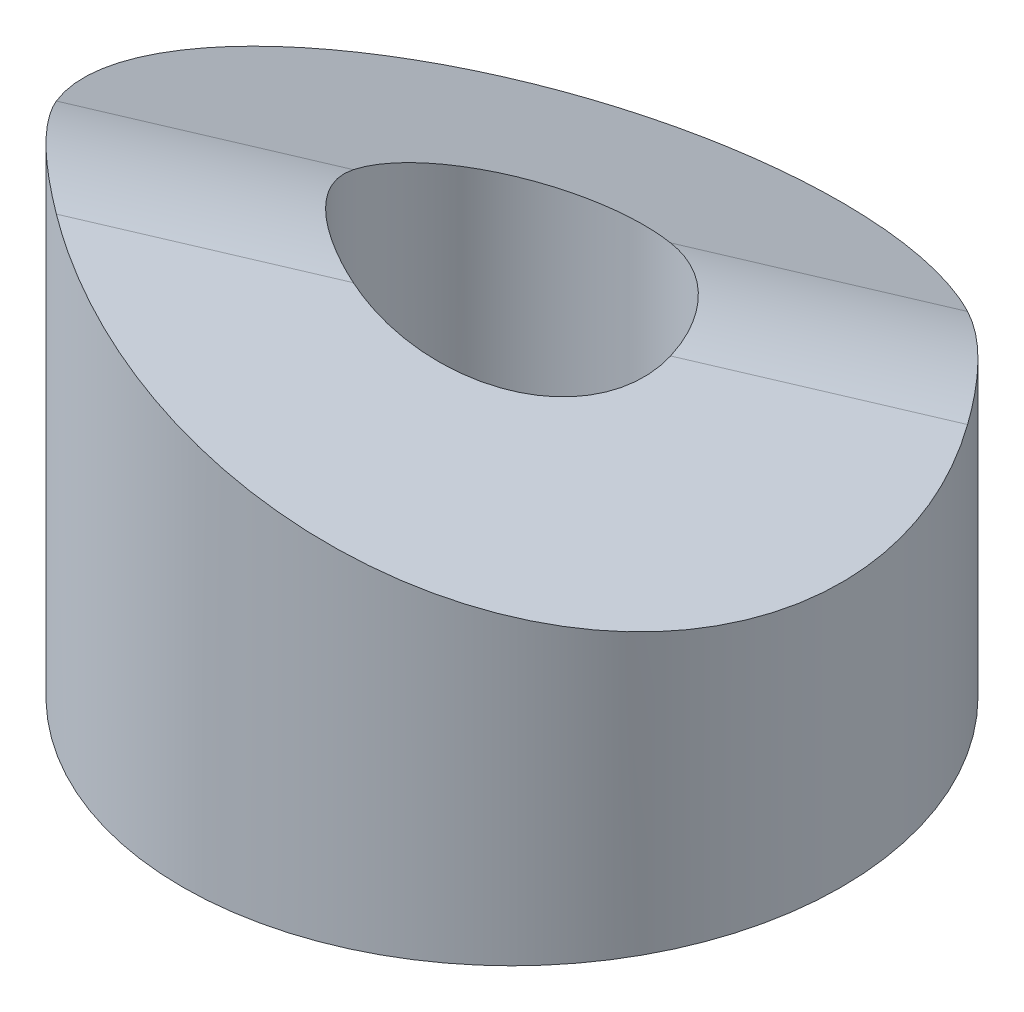
ISO-10303-21;
HEADER;
FILE_DESCRIPTION(('STEP AP214'),'2;1');
FILE_NAME('part.step','',(''),(''),'','','');
FILE_SCHEMA(('AUTOMOTIVE_DESIGN { 1 0 10303 214 1 1 1 1 }'));
ENDSEC;
DATA;
#1=APPLICATION_CONTEXT('core data for automotive mechanical design processes');
#2=APPLICATION_PROTOCOL_DEFINITION('international standard','automotive_design',2000,#1);
#3=PRODUCT_CONTEXT('',#1,'mechanical');
#4=PRODUCT('Part','Part','',(#3));
#5=PRODUCT_RELATED_PRODUCT_CATEGORY('part','',(#4));
#6=PRODUCT_DEFINITION_FORMATION('','',#4);
#7=PRODUCT_DEFINITION_CONTEXT('part definition',#1,'design');
#8=PRODUCT_DEFINITION('design','',#6,#7);
#9=PRODUCT_DEFINITION_SHAPE('','',#8);
#10=(LENGTH_UNIT() NAMED_UNIT(*) SI_UNIT(.MILLI.,.METRE.));
#11=(NAMED_UNIT(*) PLANE_ANGLE_UNIT() SI_UNIT($,.RADIAN.));
#12=(NAMED_UNIT(*) SI_UNIT($,.STERADIAN.) SOLID_ANGLE_UNIT());
#13=UNCERTAINTY_MEASURE_WITH_UNIT(LENGTH_MEASURE(1.E-05),#10,'distance_accuracy_value','');
#14=(GEOMETRIC_REPRESENTATION_CONTEXT(3) GLOBAL_UNCERTAINTY_ASSIGNED_CONTEXT((#13)) GLOBAL_UNIT_ASSIGNED_CONTEXT((#10,
#11,#12)) REPRESENTATION_CONTEXT('',''));
#15=CARTESIAN_POINT('',(0.,0.,0.));
#16=DIRECTION('',(0.,0.,1.));
#17=DIRECTION('',(1.,0.,0.));
#18=AXIS2_PLACEMENT_3D('',#15,#16,#17);
#19=CARTESIAN_POINT('',(0.,12.7,0.));
#20=DIRECTION('',(0.,-1.,0.));
#21=DIRECTION('',(0.,0.,-1.));
#22=AXIS2_PLACEMENT_3D('',#19,#20,#21);
#23=CYLINDRICAL_SURFACE('',#22,7.9375);
#24=CARTESIAN_POINT('',(0.,0.,0.));
#25=DIRECTION('',(0.,1.,0.));
#26=DIRECTION('',(0.,0.,1.));
#27=AXIS2_PLACEMENT_3D('',#24,#25,#26);
#28=CIRCLE('',#27,7.9375);
#29=CARTESIAN_POINT('',(0.,0.,7.9375));
#30=VERTEX_POINT('',#29);
#31=EDGE_CURVE('E110',#30,#30,#28,.T.);
#32=ORIENTED_EDGE('',*,*,#31,.T.);
#33=EDGE_LOOP('',(#32));
#34=FACE_BOUND('',#33,.T.);
#35=CARTESIAN_POINT('',(0.,9.525,0.));
#36=DIRECTION('',(0.,-0.928476690885259,0.371390676354104));
#37=DIRECTION('',(0.,-0.371390676354104,-0.92847669088526));
#38=AXIS2_PLACEMENT_3D('',#35,#36,#37);
#39=ELLIPSE('',#38,8.54894913132602,7.9375);
#40=CARTESIAN_POINT('',(-6.66656205617944,11.2482925045324,4.30823126133088));
#41=VERTEX_POINT('',#40);
#42=CARTESIAN_POINT('',(4.30823126133088,6.85837517752823,-6.66656205617944));
#43=VERTEX_POINT('',#42);
#44=EDGE_CURVE('E89',#41,#43,#39,.T.);
#45=ORIENTED_EDGE('',*,*,#44,.T.);
#46=CARTESIAN_POINT('',(4.30823126133088,6.85837517752823,-6.66656205617944));
#47=CARTESIAN_POINT('',(4.44018053283376,6.89249503951867,-6.58132556952442));
#48=CARTESIAN_POINT('',(4.57043572017866,6.92193001275825,-6.49156235753595));
#49=CARTESIAN_POINT('',(4.82654034498174,6.97121347274696,-6.30345486665733));
#50=CARTESIAN_POINT('',(4.95238856077898,6.99105932049479,-6.20510823432544));
#51=CARTESIAN_POINT('',(5.19552041054119,7.02055664741903,-6.002904849344));
#52=CARTESIAN_POINT('',(5.31293931876672,7.03044983553693,-5.89924647110299));
#53=CARTESIAN_POINT('',(5.54159838903361,7.04080566970517,-5.68499438169255));
#54=CARTESIAN_POINT('',(5.65284038918268,7.0412711363928,-5.5744027547836));
#55=CARTESIAN_POINT('',(5.92868456462497,7.03036596915545,-5.28338028838821));
#56=CARTESIAN_POINT('',(6.08839084588869,7.01223991073966,-5.09843925089711));
#57=CARTESIAN_POINT('',(6.31489127127382,6.96790187456653,-4.81055576389274));
#58=CARTESIAN_POINT('',(6.38888093281967,6.94999835184293,-4.71181642470069));
#59=CARTESIAN_POINT('',(6.53165813283735,6.90845798798185,-4.51181058708581));
#60=CARTESIAN_POINT('',(6.60044558395637,6.8848210505999,-4.41054404626549));
#61=CARTESIAN_POINT('',(6.66656205617943,6.85837517752823,-4.30823126133088));
#62=B_SPLINE_CURVE_WITH_KNOTS('',3,(#46,#47,#48,#49,#50,#51,#52,#53,#54,#55,#56,#57,#58,#59,#60,
#61),.UNSPECIFIED.,.F.,.F.,(4,2,2,2,2,2,2,4),(0.,0.48212803022374,0.964388670332843,
1.43463191620439,1.90473447004844,2.63738065918797,3.01119213682577,3.38500988991819),.UNSPECIFIED.);
#63=CARTESIAN_POINT('',(6.66656205617944,6.85837517752823,-4.30823126133088));
#64=VERTEX_POINT('',#63);
#65=EDGE_CURVE('E95',#43,#64,#62,.T.);
#66=ORIENTED_EDGE('',*,*,#65,.T.);
#67=CARTESIAN_POINT('',(0.,9.525,0.));
#68=DIRECTION('',(-0.371390676354104,-0.928476690885259,0.));
#69=DIRECTION('',(0.92847669088526,-0.371390676354104,0.));
#70=AXIS2_PLACEMENT_3D('',#67,#68,#69);
#71=ELLIPSE('',#70,8.54894913132602,7.9375);
#72=CARTESIAN_POINT('',(-4.30823126133088,11.2482925045323,6.66656205617944));
#73=VERTEX_POINT('',#72);
#74=EDGE_CURVE('E90',#64,#73,#71,.T.);
#75=ORIENTED_EDGE('',*,*,#74,.T.);
#76=CARTESIAN_POINT('',(-4.30823126133088,11.2482925045323,6.66656205617944));
#77=CARTESIAN_POINT('',(-4.40750733230858,11.2880217792611,6.60242527729172));
#78=CARTESIAN_POINT('',(-4.50644474603532,11.3239294478226,6.53532505164408));
#79=CARTESIAN_POINT('',(-4.70294443046754,11.3875932973205,6.39536618779092));
#80=CARTESIAN_POINT('',(-4.80050586510717,11.4153447097237,6.32250421245663));
#81=CARTESIAN_POINT('',(-4.99334935944246,11.4621186403639,6.17133526254932));
#82=CARTESIAN_POINT('',(-5.08863343440826,11.4811491690885,6.09303336122781));
#83=CARTESIAN_POINT('',(-5.2761950538548,11.5101399590878,5.93135666127639));
#84=CARTESIAN_POINT('',(-5.36847336876836,11.5201025625655,5.84798317855148));
#85=CARTESIAN_POINT('',(-5.5496106899698,11.530774621615,5.67638516397554));
#86=CARTESIAN_POINT('',(-5.63845600732794,11.5314502181526,5.58814405823189));
#87=CARTESIAN_POINT('',(-5.81166903060222,11.5234463225004,5.40777616773249));
#88=CARTESIAN_POINT('',(-5.89603666499984,11.5147666809339,5.31564932095499));
#89=CARTESIAN_POINT('',(-6.05958581820048,11.4882581435298,5.12842632331201));
#90=CARTESIAN_POINT('',(-6.13877497864839,11.4704430883957,5.03333486811469));
#91=CARTESIAN_POINT('',(-6.29165349004505,11.42603692491,4.84087766199855));
#92=CARTESIAN_POINT('',(-6.3653452876548,11.3994497496032,4.74351294845833));
#93=CARTESIAN_POINT('',(-6.47646096775292,11.3512471395866,4.58956509662136));
#94=CARTESIAN_POINT('',(-6.51583066433088,11.3324255027004,4.53348627564056));
#95=CARTESIAN_POINT('',(-6.5926326299594,11.2922409959197,4.42105531497422));
#96=CARTESIAN_POINT('',(-6.63006788168686,11.2708822166053,4.36470375206143));
#97=CARTESIAN_POINT('',(-6.66656205617944,11.2482925045324,4.30823126133088));
#98=B_SPLINE_CURVE_WITH_KNOTS('',3,(#76,#77,#78,#79,#80,#81,#82,#83,#84,#85,#86,#87,#88,#89,#90,
#91,#92,#93,#94,#95,#96,#97),.UNSPECIFIED.,.F.,.F.,(4,2,2,2,2,2,2,2,2,2,4),(0.,
0.374033310793306,0.748284866124966,1.12219196366536,1.4960024553053,1.87117544396496,
2.24635442316631,2.62096665561494,2.99541115563377,3.20851686847709,3.42128354360048),.UNSPECIFIED.);
#99=EDGE_CURVE('E87',#73,#41,#98,.T.);
#100=ORIENTED_EDGE('',*,*,#99,.T.);
#101=EDGE_LOOP('',(#45,#66,#75,#100));
#102=FACE_BOUND('',#101,.T.);
#103=ADVANCED_FACE('F39',(#34,#102),#23,.T.);
#104=CARTESIAN_POINT('',(0.,0.,0.));
#105=DIRECTION('',(0.,1.,0.));
#106=DIRECTION('',(0.,0.,1.));
#107=AXIS2_PLACEMENT_3D('',#104,#105,#106);
#108=PLANE('',#107);
#109=ORIENTED_EDGE('',*,*,#31,.F.);
#110=EDGE_LOOP('',(#109));
#111=FACE_BOUND('',#110,.T.);
#112=CARTESIAN_POINT('',(0.,0.,0.));
#113=DIRECTION('',(0.,1.,0.));
#114=DIRECTION('',(0.,0.,1.));
#115=AXIS2_PLACEMENT_3D('',#112,#113,#114);
#116=CIRCLE('',#115,3.175);
#117=CARTESIAN_POINT('',(0.,0.,3.175));
#118=VERTEX_POINT('',#117);
#119=EDGE_CURVE('E106',#118,#118,#116,.T.);
#120=ORIENTED_EDGE('',*,*,#119,.T.);
#121=EDGE_LOOP('',(#120));
#122=FACE_BOUND('',#121,.T.);
#123=ADVANCED_FACE('F132',(#111,#122),#108,.F.);
#124=CARTESIAN_POINT('',(0.,12.7,0.));
#125=DIRECTION('',(0.,-1.,0.));
#126=DIRECTION('',(0.,0.,-1.));
#127=AXIS2_PLACEMENT_3D('',#124,#125,#126);
#128=CYLINDRICAL_SURFACE('',#127,3.175);
#129=CARTESIAN_POINT('',(0.,9.525,0.));
#130=DIRECTION('',(-0.371390676354104,-0.928476690885259,0.));
#131=DIRECTION('',(0.92847669088526,-0.371390676354104,0.));
#132=AXIS2_PLACEMENT_3D('',#129,#130,#131);
#133=ELLIPSE('',#132,3.41957965253041,3.175);
#134=CARTESIAN_POINT('',(3.08963169273473,8.28914732290611,-0.731300897886174));
#135=VERTEX_POINT('',#134);
#136=CARTESIAN_POINT('',(-0.731300897886171,9.81752035915447,3.08963169273473));
#137=VERTEX_POINT('',#136);
#138=EDGE_CURVE('E149',#135,#137,#133,.T.);
#139=ORIENTED_EDGE('',*,*,#138,.F.);
#140=CARTESIAN_POINT('',(3.08963169273473,8.28914732290611,-0.731300897886173));
#141=CARTESIAN_POINT('',(3.06936290011752,8.29726711196511,-0.816961562861372));
#142=CARTESIAN_POINT('',(3.04551644804464,8.30526041723585,-0.901786963212657));
#143=CARTESIAN_POINT('',(2.99084166337354,8.32063053274964,-1.06922312023403));
#144=CARTESIAN_POINT('',(2.96001265226662,8.32800728298541,-1.15183366080888));
#145=CARTESIAN_POINT('',(2.8915560140739,8.34177787048075,-1.31426531204879));
#146=CARTESIAN_POINT('',(2.85392954317246,8.34817187455447,-1.39408689433834));
#147=CARTESIAN_POINT('',(2.7721407924476,8.35969257996766,-1.55037104853168));
#148=CARTESIAN_POINT('',(2.72797888907768,8.36481935425661,-1.62683381358105));
#149=CARTESIAN_POINT('',(2.58597168220242,8.37794352429865,-1.85054587687588));
#150=CARTESIAN_POINT('',(2.47862633493533,8.3836801965786,-1.99206808493242));
#151=CARTESIAN_POINT('',(2.24187616828036,8.38809051877317,-2.25520823053523));
#152=CARTESIAN_POINT('',(2.11247791491635,8.3867662674604,-2.37683207154888));
#153=CARTESIAN_POINT('',(1.83758445170494,8.3773789420086,-2.5950402635009));
#154=CARTESIAN_POINT('',(1.69237045614953,8.36942084797047,-2.69198416569193));
#155=CARTESIAN_POINT('',(1.38839585547521,8.34822328070023,-2.86061693874038));
#156=CARTESIAN_POINT('',(1.22964840974084,8.33498889289879,-2.93233000281748));
#157=CARTESIAN_POINT('',(1.01146882106813,8.3153610088605,-3.01014632644718));
#158=CARTESIAN_POINT('',(0.955980477148669,8.31025033233097,-3.02822355677269));
#159=CARTESIAN_POINT('',(0.844222735743901,8.29982521413436,-3.06125658887335));
#160=CARTESIAN_POINT('',(0.78795512445771,8.29451120091828,-3.07621856769718));
#161=CARTESIAN_POINT('',(0.731300897886174,8.28914732290612,-3.08963169273474));
#162=B_SPLINE_CURVE_WITH_KNOTS('',3,(#140,#141,#142,#143,#144,#145,#146,#147,#148,#149,#150,
#151,#152,#153,#154,#155,#156,#157,#158,#159,#160,#161),.UNSPECIFIED.,.F.,.F.,(4,2,2,2,2,2,2,2,
2,2,4),(0.,0.265121296265737,0.530268365939277,0.795370378963716,1.06045712754075,
1.59079466503531,2.12097457501495,2.64292025937911,3.16436409026157,3.34004663380676,
3.51537743771858),.UNSPECIFIED.);
#163=CARTESIAN_POINT('',(0.731300897886173,8.28914732290611,-3.08963169273473));
#164=VERTEX_POINT('',#163);
#165=EDGE_CURVE('E11',#135,#164,#162,.T.);
#166=ORIENTED_EDGE('',*,*,#165,.T.);
#167=CARTESIAN_POINT('',(0.,9.525,0.));
#168=DIRECTION('',(0.,-0.928476690885259,0.371390676354104));
#169=DIRECTION('',(0.,-0.371390676354104,-0.92847669088526));
#170=AXIS2_PLACEMENT_3D('',#167,#168,#169);
#171=ELLIPSE('',#170,3.41957965253041,3.175);
#172=CARTESIAN_POINT('',(-3.08963169273473,9.81752035915447,0.731300897886174));
#173=VERTEX_POINT('',#172);
#174=EDGE_CURVE('E107',#173,#164,#171,.T.);
#175=ORIENTED_EDGE('',*,*,#174,.F.);
#176=CARTESIAN_POINT('',(-3.08963169273473,9.81752035915447,0.731300897886173));
#177=CARTESIAN_POINT('',(-3.07291325286018,9.84576386928195,0.801912794686016));
#178=CARTESIAN_POINT('',(-3.0536858098634,9.87289943232162,0.872356890384114));
#179=CARTESIAN_POINT('',(-3.01007375048613,9.92457477799821,1.01266831460719));
#180=CARTESIAN_POINT('',(-2.98568469504534,9.94911229885396,1.08253509254411));
#181=CARTESIAN_POINT('',(-2.90434508812158,10.0184166762778,1.29141897725338));
#182=CARTESIAN_POINT('',(-2.83938693661574,10.0585840232631,1.42900580108907));
#183=CARTESIAN_POINT('',(-2.68796612731163,10.12344807372,1.69683307100598));
#184=CARTESIAN_POINT('',(-2.60139169474527,10.1480619403985,1.82703087480001));
#185=CARTESIAN_POINT('',(-2.40897621559537,10.1789481561992,2.07408616035828));
#186=CARTESIAN_POINT('',(-2.30321079007414,10.1852909022488,2.19099317236119));
#187=CARTESIAN_POINT('',(-2.08606150007661,10.1794231843635,2.39779541998869));
#188=CARTESIAN_POINT('',(-1.97603627211835,10.1688285022043,2.4891738642284));
#189=CARTESIAN_POINT('',(-1.74600822694144,10.1329723239635,2.65561816397156));
#190=CARTESIAN_POINT('',(-1.62597584642332,10.1076659491559,2.73063313468481));
#191=CARTESIAN_POINT('',(-1.37820798478118,10.0439864240772,2.86377323771674));
#192=CARTESIAN_POINT('',(-1.25039616010745,10.0054570218315,2.92168024039671));
#193=CARTESIAN_POINT('',(-1.05667198147985,9.94007274279415,2.99479892858155));
#194=CARTESIAN_POINT('',(-0.991914134228299,9.91707452199074,3.01684645890185));
#195=CARTESIAN_POINT('',(-0.861918916799407,9.86887335376896,3.05652188452795));
#196=CARTESIAN_POINT('',(-0.796681907458676,9.84367193515867,3.07415281220684));
#197=CARTESIAN_POINT('',(-0.731300897886172,9.81752035915447,3.08963169273473));
#198=B_SPLINE_CURVE_WITH_KNOTS('',3,(#176,#177,#178,#179,#180,#181,#182,#183,#184,#185,#186,
#187,#188,#189,#190,#191,#192,#193,#194,#195,#196,#197),.UNSPECIFIED.,.F.,.F.,(4,2,2,2,2,2,2,2,
2,2,4),(0.,0.233508329893502,0.467218302327607,0.936978642059213,1.40922026193822,
1.87963992917348,2.30779290285737,2.73725888291628,3.17198518335522,3.38835492624646,
3.60457570322214),.UNSPECIFIED.);
#199=EDGE_CURVE('E54',#173,#137,#198,.T.);
#200=ORIENTED_EDGE('',*,*,#199,.T.);
#201=EDGE_LOOP('',(#139,#166,#175,#200));
#202=FACE_BOUND('',#201,.T.);
#203=ORIENTED_EDGE('',*,*,#119,.F.);
#204=EDGE_LOOP('',(#203));
#205=FACE_BOUND('',#204,.T.);
#206=ADVANCED_FACE('F147',(#202,#205),#128,.F.);
#207=CARTESIAN_POINT('',(-7.9375,12.7,7.9375));
#208=DIRECTION('',(0.,-0.928476690885259,0.371390676354104));
#209=DIRECTION('',(0.,-0.371390676354104,-0.928476690885259));
#210=AXIS2_PLACEMENT_3D('',#207,#208,#209);
#211=PLANE('',#210);
#212=ORIENTED_EDGE('',*,*,#174,.T.);
#213=DIRECTION('',(0.680413817439772,-0.272165526975909,-0.680413817439772));
#214=VECTOR('',#213,1.);
#215=CARTESIAN_POINT('',(-9.20401098241867,12.263272075028,6.84568018757011));
#216=LINE('',#215,#214);
#217=EDGE_CURVE('E96',#164,#43,#216,.T.);
#218=ORIENTED_EDGE('',*,*,#217,.T.);
#219=ORIENTED_EDGE('',*,*,#44,.F.);
#220=DIRECTION('',(0.680413817439772,-0.272165526975909,-0.680413817439772));
#221=VECTOR('',#220,1.);
#222=CARTESIAN_POINT('',(-9.20401098241867,12.263272075028,6.84568018757011));
#223=LINE('',#222,#221);
#224=EDGE_CURVE('E103',#41,#173,#223,.T.);
#225=ORIENTED_EDGE('',*,*,#224,.T.);
#226=EDGE_LOOP('',(#212,#218,#219,#225));
#227=FACE_BOUND('',#226,.T.);
#228=ADVANCED_FACE('F102',(#227),#211,.F.);
#229=CARTESIAN_POINT('',(3.28448275862069,8.21120689655172,-7.9375));
#230=DIRECTION('',(-0.371390676354104,-0.928476690885259,0.));
#231=DIRECTION('',(0.928476690885259,-0.371390676354104,0.));
#232=AXIS2_PLACEMENT_3D('',#229,#230,#231);
#233=PLANE('',#232);
#234=ORIENTED_EDGE('',*,*,#74,.F.);
#235=DIRECTION('',(0.680413817439772,-0.272165526975909,-0.680413817439772));
#236=VECTOR('',#235,1.);
#237=CARTESIAN_POINT('',(6.5304772198373,6.91280911206508,-4.17214642498874));
#238=LINE('',#237,#236);
#239=EDGE_CURVE('E67',#64,#135,#238,.F.);
#240=ORIENTED_EDGE('',*,*,#239,.T.);
#241=ORIENTED_EDGE('',*,*,#138,.T.);
#242=DIRECTION('',(0.680413817439772,-0.272165526975909,-0.680413817439772));
#243=VECTOR('',#242,1.);
#244=CARTESIAN_POINT('',(6.5304772198373,6.91280911206508,-4.17214642498874));
#245=LINE('',#244,#243);
#246=EDGE_CURVE('E176',#137,#73,#245,.F.);
#247=ORIENTED_EDGE('',*,*,#246,.T.);
#248=EDGE_LOOP('',(#234,#240,#241,#247));
#249=FACE_BOUND('',#248,.T.);
#250=ADVANCED_FACE('F138',(#249),#233,.F.);
#251=CARTESIAN_POINT('',(-9.20401098241867,6.36744508790665,9.20401098241867));
#252=DIRECTION('',(0.680413817439772,-0.272165526975909,-0.680413817439772));
#253=DIRECTION('',(-0.707106781186548,0.,-0.707106781186548));
#254=AXIS2_PLACEMENT_3D('',#251,#252,#253);
#255=CYLINDRICAL_SURFACE('',#254,6.35);
#256=ORIENTED_EDGE('',*,*,#165,.F.);
#257=ORIENTED_EDGE('',*,*,#239,.F.);
#258=ORIENTED_EDGE('',*,*,#65,.F.);
#259=ORIENTED_EDGE('',*,*,#217,.F.);
#260=EDGE_LOOP('',(#256,#257,#258,#259));
#261=FACE_BOUND('',#260,.T.);
#262=ADVANCED_FACE('F134',(#261),#255,.T.);
#263=CARTESIAN_POINT('',(-9.20401098241867,6.36744508790665,9.20401098241867));
#264=DIRECTION('',(0.680413817439772,-0.272165526975909,-0.680413817439772));
#265=DIRECTION('',(-0.707106781186548,0.,-0.707106781186548));
#266=AXIS2_PLACEMENT_3D('',#263,#264,#265);
#267=CYLINDRICAL_SURFACE('',#266,6.35);
#268=ORIENTED_EDGE('',*,*,#99,.F.);
#269=ORIENTED_EDGE('',*,*,#246,.F.);
#270=ORIENTED_EDGE('',*,*,#199,.F.);
#271=ORIENTED_EDGE('',*,*,#224,.F.);
#272=EDGE_LOOP('',(#268,#269,#270,#271));
#273=FACE_BOUND('',#272,.T.);
#274=ADVANCED_FACE('F41',(#273),#267,.T.);
#275=CLOSED_SHELL('',(#103,#123,#206,#228,#250,#262,#274));
#276=MANIFOLD_SOLID_BREP('B2',#275);
#277=ADVANCED_BREP_SHAPE_REPRESENTATION('',(#18,#276),#14);
#278=SHAPE_DEFINITION_REPRESENTATION(#9,#277);
ENDSEC;
END-ISO-10303-21;
